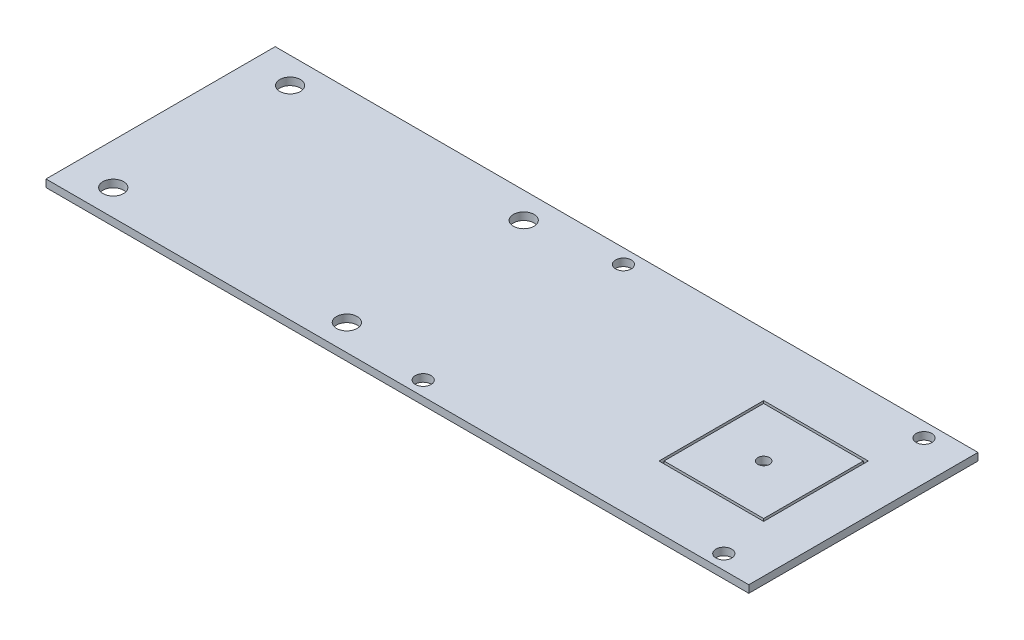
ISO-10303-21;
HEADER;
FILE_DESCRIPTION(('STEP AP214'),'2;1');
FILE_NAME('part.step','',(''),(''),'','','');
FILE_SCHEMA(('AUTOMOTIVE_DESIGN { 1 0 10303 214 1 1 1 1 }'));
ENDSEC;
DATA;
#1=APPLICATION_CONTEXT('core data for automotive mechanical design processes');
#2=APPLICATION_PROTOCOL_DEFINITION('international standard','automotive_design',2000,#1);
#3=PRODUCT_CONTEXT('',#1,'mechanical');
#4=PRODUCT('Part','Part','',(#3));
#5=PRODUCT_RELATED_PRODUCT_CATEGORY('part','',(#4));
#6=PRODUCT_DEFINITION_FORMATION('','',#4);
#7=PRODUCT_DEFINITION_CONTEXT('part definition',#1,'design');
#8=PRODUCT_DEFINITION('design','',#6,#7);
#9=PRODUCT_DEFINITION_SHAPE('','',#8);
#10=(LENGTH_UNIT() NAMED_UNIT(*) SI_UNIT(.MILLI.,.METRE.));
#11=(NAMED_UNIT(*) PLANE_ANGLE_UNIT() SI_UNIT($,.RADIAN.));
#12=(NAMED_UNIT(*) SI_UNIT($,.STERADIAN.) SOLID_ANGLE_UNIT());
#13=UNCERTAINTY_MEASURE_WITH_UNIT(LENGTH_MEASURE(1.E-05),#10,'distance_accuracy_value','');
#14=(GEOMETRIC_REPRESENTATION_CONTEXT(3) GLOBAL_UNCERTAINTY_ASSIGNED_CONTEXT((#13)) GLOBAL_UNIT_ASSIGNED_CONTEXT((#10,
#11,#12)) REPRESENTATION_CONTEXT('',''));
#15=CARTESIAN_POINT('',(0.,0.,0.));
#16=DIRECTION('',(0.,0.,1.));
#17=DIRECTION('',(1.,0.,0.));
#18=AXIS2_PLACEMENT_3D('',#15,#16,#17);
#19=CARTESIAN_POINT('',(0.,1.5,0.));
#20=DIRECTION('',(0.,-1.,0.));
#21=DIRECTION('',(0.,0.,-1.));
#22=AXIS2_PLACEMENT_3D('',#19,#20,#21);
#23=PLANE('',#22);
#24=CARTESIAN_POINT('',(50.51,1.5,0.));
#25=DIRECTION('',(0.,1.,0.));
#26=DIRECTION('',(0.,0.,1.));
#27=AXIS2_PLACEMENT_3D('',#24,#25,#26);
#28=CIRCLE('',#27,1.185);
#29=CARTESIAN_POINT('',(50.51,1.5,1.185));
#30=VERTEX_POINT('',#29);
#31=EDGE_CURVE('E224',#30,#30,#28,.T.);
#32=ORIENTED_EDGE('',*,*,#31,.F.);
#33=EDGE_LOOP('',(#32));
#34=FACE_BOUND('',#33,.T.);
#35=DIRECTION('',(0.,0.,-1.));
#36=VECTOR('',#35,1.);
#37=CARTESIAN_POINT('',(60.51,1.5,10.));
#38=LINE('',#37,#36);
#39=CARTESIAN_POINT('',(60.51,1.5,10.));
#40=VERTEX_POINT('',#39);
#41=CARTESIAN_POINT('',(60.51,1.5,-10.));
#42=VERTEX_POINT('',#41);
#43=EDGE_CURVE('E185',#40,#42,#38,.T.);
#44=ORIENTED_EDGE('',*,*,#43,.T.);
#45=DIRECTION('',(-1.,0.,0.));
#46=VECTOR('',#45,1.);
#47=CARTESIAN_POINT('',(40.51,1.5,-10.));
#48=LINE('',#47,#46);
#49=CARTESIAN_POINT('',(40.51,1.5,-10.));
#50=VERTEX_POINT('',#49);
#51=EDGE_CURVE('E158',#42,#50,#48,.T.);
#52=ORIENTED_EDGE('',*,*,#51,.T.);
#53=DIRECTION('',(0.,0.,1.));
#54=VECTOR('',#53,1.);
#55=CARTESIAN_POINT('',(40.51,1.5,10.));
#56=LINE('',#55,#54);
#57=CARTESIAN_POINT('',(40.51,1.5,10.));
#58=VERTEX_POINT('',#57);
#59=EDGE_CURVE('E86',#50,#58,#56,.T.);
#60=ORIENTED_EDGE('',*,*,#59,.T.);
#61=DIRECTION('',(1.,0.,0.));
#62=VECTOR('',#61,1.);
#63=CARTESIAN_POINT('',(40.51,1.5,10.));
#64=LINE('',#63,#62);
#65=EDGE_CURVE('E178',#58,#40,#64,.T.);
#66=ORIENTED_EDGE('',*,*,#65,.T.);
#67=EDGE_LOOP('',(#44,#52,#60,#66));
#68=FACE_BOUND('',#67,.T.);
#69=ADVANCED_FACE('F63',(#34,#68),#23,.F.);
#70=DIRECTION('',(-1.,0.,0.));
#71=VECTOR('',#70,1.);
#72=CARTESIAN_POINT('',(0.,1.5,-10.5));
#73=LINE('',#72,#71);
#74=CARTESIAN_POINT('',(61.01,1.5,-10.5));
#75=VERTEX_POINT('',#74);
#76=CARTESIAN_POINT('',(40.01,1.5,-10.5));
#77=VERTEX_POINT('',#76);
#78=EDGE_CURVE('E208',#75,#77,#73,.T.);
#79=ORIENTED_EDGE('',*,*,#78,.F.);
#80=DIRECTION('',(0.,0.,-1.));
#81=VECTOR('',#80,1.);
#82=CARTESIAN_POINT('',(61.01,1.5,0.));
#83=LINE('',#82,#81);
#84=CARTESIAN_POINT('',(61.01,1.5,10.5));
#85=VERTEX_POINT('',#84);
#86=EDGE_CURVE('E78',#85,#75,#83,.T.);
#87=ORIENTED_EDGE('',*,*,#86,.F.);
#88=DIRECTION('',(1.,0.,0.));
#89=VECTOR('',#88,1.);
#90=CARTESIAN_POINT('',(0.,1.5,10.5));
#91=LINE('',#90,#89);
#92=CARTESIAN_POINT('',(40.01,1.5,10.5));
#93=VERTEX_POINT('',#92);
#94=EDGE_CURVE('E197',#93,#85,#91,.T.);
#95=ORIENTED_EDGE('',*,*,#94,.F.);
#96=DIRECTION('',(0.,0.,1.));
#97=VECTOR('',#96,1.);
#98=CARTESIAN_POINT('',(40.01,1.5,0.));
#99=LINE('',#98,#97);
#100=EDGE_CURVE('E211',#77,#93,#99,.T.);
#101=ORIENTED_EDGE('',*,*,#100,.F.);
#102=EDGE_LOOP('',(#79,#87,#95,#101));
#103=FACE_BOUND('',#102,.T.);
#104=DIRECTION('',(0.,0.,-1.));
#105=VECTOR('',#104,1.);
#106=CARTESIAN_POINT('',(70.525,1.5,23.));
#107=LINE('',#106,#105);
#108=CARTESIAN_POINT('',(70.525,1.5,23.));
#109=VERTEX_POINT('',#108);
#110=CARTESIAN_POINT('',(70.525,1.5,-23.));
#111=VERTEX_POINT('',#110);
#112=EDGE_CURVE('E278',#109,#111,#107,.T.);
#113=ORIENTED_EDGE('',*,*,#112,.T.);
#114=DIRECTION('',(-1.,0.,0.));
#115=VECTOR('',#114,1.);
#116=CARTESIAN_POINT('',(-70.525,1.5,-23.));
#117=LINE('',#116,#115);
#118=CARTESIAN_POINT('',(-70.525,1.5,-23.));
#119=VERTEX_POINT('',#118);
#120=EDGE_CURVE('E281',#111,#119,#117,.T.);
#121=ORIENTED_EDGE('',*,*,#120,.T.);
#122=DIRECTION('',(0.,0.,1.));
#123=VECTOR('',#122,1.);
#124=CARTESIAN_POINT('',(-70.525,1.5,23.));
#125=LINE('',#124,#123);
#126=CARTESIAN_POINT('',(-70.525,1.5,23.));
#127=VERTEX_POINT('',#126);
#128=EDGE_CURVE('E284',#119,#127,#125,.T.);
#129=ORIENTED_EDGE('',*,*,#128,.T.);
#130=DIRECTION('',(1.,0.,0.));
#131=VECTOR('',#130,1.);
#132=CARTESIAN_POINT('',(-70.525,1.5,23.));
#133=LINE('',#132,#131);
#134=EDGE_CURVE('E286',#127,#109,#133,.T.);
#135=ORIENTED_EDGE('',*,*,#134,.T.);
#136=EDGE_LOOP('',(#113,#121,#129,#135));
#137=FACE_BOUND('',#136,.T.);
#138=CARTESIAN_POINT('',(-62.28,1.5,17.75));
#139=DIRECTION('',(0.,1.,0.));
#140=DIRECTION('',(0.,0.,1.));
#141=AXIS2_PLACEMENT_3D('',#138,#139,#140);
#142=CIRCLE('',#141,2.075);
#143=CARTESIAN_POINT('',(-62.28,1.5,19.825));
#144=VERTEX_POINT('',#143);
#145=EDGE_CURVE('E272',#144,#144,#142,.T.);
#146=ORIENTED_EDGE('',*,*,#145,.F.);
#147=EDGE_LOOP('',(#146));
#148=FACE_BOUND('',#147,.T.);
#149=CARTESIAN_POINT('',(-15.4,1.5,17.75));
#150=DIRECTION('',(0.,1.,0.));
#151=DIRECTION('',(0.,0.,1.));
#152=AXIS2_PLACEMENT_3D('',#149,#150,#151);
#153=CIRCLE('',#152,2.075);
#154=CARTESIAN_POINT('',(-15.4,1.5,19.825));
#155=VERTEX_POINT('',#154);
#156=EDGE_CURVE('E266',#155,#155,#153,.T.);
#157=ORIENTED_EDGE('',*,*,#156,.F.);
#158=EDGE_LOOP('',(#157));
#159=FACE_BOUND('',#158,.T.);
#160=CARTESIAN_POINT('',(-15.4,1.5,-17.75));
#161=DIRECTION('',(0.,1.,0.));
#162=DIRECTION('',(0.,0.,1.));
#163=AXIS2_PLACEMENT_3D('',#160,#161,#162);
#164=CIRCLE('',#163,2.075);
#165=CARTESIAN_POINT('',(-15.4,1.5,-15.675));
#166=VERTEX_POINT('',#165);
#167=EDGE_CURVE('E260',#166,#166,#164,.T.);
#168=ORIENTED_EDGE('',*,*,#167,.F.);
#169=EDGE_LOOP('',(#168));
#170=FACE_BOUND('',#169,.T.);
#171=CARTESIAN_POINT('',(-62.28,1.5,-17.75));
#172=DIRECTION('',(0.,1.,0.));
#173=DIRECTION('',(0.,0.,1.));
#174=AXIS2_PLACEMENT_3D('',#171,#172,#173);
#175=CIRCLE('',#174,2.075);
#176=CARTESIAN_POINT('',(-62.28,1.5,-15.675));
#177=VERTEX_POINT('',#176);
#178=EDGE_CURVE('E254',#177,#177,#175,.T.);
#179=ORIENTED_EDGE('',*,*,#178,.F.);
#180=EDGE_LOOP('',(#179));
#181=FACE_BOUND('',#180,.T.);
#182=CARTESIAN_POINT('',(2.27,1.5,20.09));
#183=DIRECTION('',(0.,1.,0.));
#184=DIRECTION('',(0.,0.,1.));
#185=AXIS2_PLACEMENT_3D('',#182,#183,#184);
#186=CIRCLE('',#185,1.575);
#187=CARTESIAN_POINT('',(2.27,1.5,21.665));
#188=VERTEX_POINT('',#187);
#189=EDGE_CURVE('E248',#188,#188,#186,.T.);
#190=ORIENTED_EDGE('',*,*,#189,.F.);
#191=EDGE_LOOP('',(#190));
#192=FACE_BOUND('',#191,.T.);
#193=CARTESIAN_POINT('',(62.6,1.5,20.09));
#194=DIRECTION('',(0.,1.,0.));
#195=DIRECTION('',(0.,0.,1.));
#196=AXIS2_PLACEMENT_3D('',#193,#194,#195);
#197=CIRCLE('',#196,1.57499999999999);
#198=CARTESIAN_POINT('',(62.6,1.5,21.665));
#199=VERTEX_POINT('',#198);
#200=EDGE_CURVE('E242',#199,#199,#197,.T.);
#201=ORIENTED_EDGE('',*,*,#200,.F.);
#202=EDGE_LOOP('',(#201));
#203=FACE_BOUND('',#202,.T.);
#204=CARTESIAN_POINT('',(62.6,1.5,-20.09));
#205=DIRECTION('',(0.,1.,0.));
#206=DIRECTION('',(0.,0.,1.));
#207=AXIS2_PLACEMENT_3D('',#204,#205,#206);
#208=CIRCLE('',#207,1.57499999999999);
#209=CARTESIAN_POINT('',(62.6,1.5,-18.515));
#210=VERTEX_POINT('',#209);
#211=EDGE_CURVE('E236',#210,#210,#208,.T.);
#212=ORIENTED_EDGE('',*,*,#211,.F.);
#213=EDGE_LOOP('',(#212));
#214=FACE_BOUND('',#213,.T.);
#215=CARTESIAN_POINT('',(2.27,1.5,-20.09));
#216=DIRECTION('',(0.,1.,0.));
#217=DIRECTION('',(0.,0.,1.));
#218=AXIS2_PLACEMENT_3D('',#215,#216,#217);
#219=CIRCLE('',#218,1.575);
#220=CARTESIAN_POINT('',(2.27,1.5,-18.515));
#221=VERTEX_POINT('',#220);
#222=EDGE_CURVE('E230',#221,#221,#219,.T.);
#223=ORIENTED_EDGE('',*,*,#222,.F.);
#224=EDGE_LOOP('',(#223));
#225=FACE_BOUND('',#224,.T.);
#226=ADVANCED_FACE('F321',(#103,#137,#148,#159,#170,#181,#192,#203,#214,#225),#23,.F.);
#227=CARTESIAN_POINT('',(0.,0.,0.));
#228=DIRECTION('',(0.,-1.,0.));
#229=DIRECTION('',(0.,0.,-1.));
#230=AXIS2_PLACEMENT_3D('',#227,#228,#229);
#231=PLANE('',#230);
#232=CARTESIAN_POINT('',(2.27,0.,-20.09));
#233=DIRECTION('',(0.,1.,0.));
#234=DIRECTION('',(0.,0.,1.));
#235=AXIS2_PLACEMENT_3D('',#232,#233,#234);
#236=CIRCLE('',#235,1.575);
#237=CARTESIAN_POINT('',(2.27,0.,-18.515));
#238=VERTEX_POINT('',#237);
#239=EDGE_CURVE('E227',#238,#238,#236,.T.);
#240=ORIENTED_EDGE('',*,*,#239,.T.);
#241=EDGE_LOOP('',(#240));
#242=FACE_BOUND('',#241,.T.);
#243=CARTESIAN_POINT('',(62.6,0.,20.09));
#244=DIRECTION('',(0.,1.,0.));
#245=DIRECTION('',(0.,0.,1.));
#246=AXIS2_PLACEMENT_3D('',#243,#244,#245);
#247=CIRCLE('',#246,1.57499999999999);
#248=CARTESIAN_POINT('',(62.6,0.,21.665));
#249=VERTEX_POINT('',#248);
#250=EDGE_CURVE('E239',#249,#249,#247,.T.);
#251=ORIENTED_EDGE('',*,*,#250,.T.);
#252=EDGE_LOOP('',(#251));
#253=FACE_BOUND('',#252,.T.);
#254=CARTESIAN_POINT('',(-62.28,0.,-17.75));
#255=DIRECTION('',(0.,1.,0.));
#256=DIRECTION('',(0.,0.,1.));
#257=AXIS2_PLACEMENT_3D('',#254,#255,#256);
#258=CIRCLE('',#257,2.075);
#259=CARTESIAN_POINT('',(-62.28,0.,-15.675));
#260=VERTEX_POINT('',#259);
#261=EDGE_CURVE('E251',#260,#260,#258,.T.);
#262=ORIENTED_EDGE('',*,*,#261,.T.);
#263=EDGE_LOOP('',(#262));
#264=FACE_BOUND('',#263,.T.);
#265=CARTESIAN_POINT('',(-15.4,0.,17.75));
#266=DIRECTION('',(0.,1.,0.));
#267=DIRECTION('',(0.,0.,1.));
#268=AXIS2_PLACEMENT_3D('',#265,#266,#267);
#269=CIRCLE('',#268,2.075);
#270=CARTESIAN_POINT('',(-15.4,0.,19.825));
#271=VERTEX_POINT('',#270);
#272=EDGE_CURVE('E263',#271,#271,#269,.T.);
#273=ORIENTED_EDGE('',*,*,#272,.T.);
#274=EDGE_LOOP('',(#273));
#275=FACE_BOUND('',#274,.T.);
#276=DIRECTION('',(0.,0.,-1.));
#277=VECTOR('',#276,1.);
#278=CARTESIAN_POINT('',(70.525,0.,23.));
#279=LINE('',#278,#277);
#280=CARTESIAN_POINT('',(70.525,0.,23.));
#281=VERTEX_POINT('',#280);
#282=CARTESIAN_POINT('',(70.525,0.,-23.));
#283=VERTEX_POINT('',#282);
#284=EDGE_CURVE('E275',#281,#283,#279,.T.);
#285=ORIENTED_EDGE('',*,*,#284,.F.);
#286=DIRECTION('',(1.,0.,0.));
#287=VECTOR('',#286,1.);
#288=CARTESIAN_POINT('',(-70.525,0.,23.));
#289=LINE('',#288,#287);
#290=CARTESIAN_POINT('',(-70.525,0.,23.));
#291=VERTEX_POINT('',#290);
#292=EDGE_CURVE('E282',#291,#281,#289,.T.);
#293=ORIENTED_EDGE('',*,*,#292,.F.);
#294=DIRECTION('',(0.,0.,1.));
#295=VECTOR('',#294,1.);
#296=CARTESIAN_POINT('',(-70.525,0.,23.));
#297=LINE('',#296,#295);
#298=CARTESIAN_POINT('',(-70.525,0.,-23.));
#299=VERTEX_POINT('',#298);
#300=EDGE_CURVE('E293',#299,#291,#297,.T.);
#301=ORIENTED_EDGE('',*,*,#300,.F.);
#302=DIRECTION('',(-1.,0.,0.));
#303=VECTOR('',#302,1.);
#304=CARTESIAN_POINT('',(-70.525,0.,-23.));
#305=LINE('',#304,#303);
#306=EDGE_CURVE('E291',#283,#299,#305,.T.);
#307=ORIENTED_EDGE('',*,*,#306,.F.);
#308=EDGE_LOOP('',(#285,#293,#301,#307));
#309=FACE_BOUND('',#308,.T.);
#310=CARTESIAN_POINT('',(-62.28,0.,17.75));
#311=DIRECTION('',(0.,1.,0.));
#312=DIRECTION('',(0.,0.,1.));
#313=AXIS2_PLACEMENT_3D('',#310,#311,#312);
#314=CIRCLE('',#313,2.075);
#315=CARTESIAN_POINT('',(-62.28,0.,19.825));
#316=VERTEX_POINT('',#315);
#317=EDGE_CURVE('E269',#316,#316,#314,.T.);
#318=ORIENTED_EDGE('',*,*,#317,.T.);
#319=EDGE_LOOP('',(#318));
#320=FACE_BOUND('',#319,.T.);
#321=CARTESIAN_POINT('',(-15.4,0.,-17.75));
#322=DIRECTION('',(0.,1.,0.));
#323=DIRECTION('',(0.,0.,1.));
#324=AXIS2_PLACEMENT_3D('',#321,#322,#323);
#325=CIRCLE('',#324,2.075);
#326=CARTESIAN_POINT('',(-15.4,0.,-15.675));
#327=VERTEX_POINT('',#326);
#328=EDGE_CURVE('E257',#327,#327,#325,.T.);
#329=ORIENTED_EDGE('',*,*,#328,.T.);
#330=EDGE_LOOP('',(#329));
#331=FACE_BOUND('',#330,.T.);
#332=CARTESIAN_POINT('',(2.27,0.,20.09));
#333=DIRECTION('',(0.,1.,0.));
#334=DIRECTION('',(0.,0.,1.));
#335=AXIS2_PLACEMENT_3D('',#332,#333,#334);
#336=CIRCLE('',#335,1.575);
#337=CARTESIAN_POINT('',(2.27,0.,21.665));
#338=VERTEX_POINT('',#337);
#339=EDGE_CURVE('E245',#338,#338,#336,.T.);
#340=ORIENTED_EDGE('',*,*,#339,.T.);
#341=EDGE_LOOP('',(#340));
#342=FACE_BOUND('',#341,.T.);
#343=CARTESIAN_POINT('',(62.6,0.,-20.09));
#344=DIRECTION('',(0.,1.,0.));
#345=DIRECTION('',(0.,0.,1.));
#346=AXIS2_PLACEMENT_3D('',#343,#344,#345);
#347=CIRCLE('',#346,1.57499999999999);
#348=CARTESIAN_POINT('',(62.6,0.,-18.515));
#349=VERTEX_POINT('',#348);
#350=EDGE_CURVE('E233',#349,#349,#347,.T.);
#351=ORIENTED_EDGE('',*,*,#350,.T.);
#352=EDGE_LOOP('',(#351));
#353=FACE_BOUND('',#352,.T.);
#354=CARTESIAN_POINT('',(50.51,0.,0.));
#355=DIRECTION('',(0.,1.,0.));
#356=DIRECTION('',(0.,0.,1.));
#357=AXIS2_PLACEMENT_3D('',#354,#355,#356);
#358=CIRCLE('',#357,1.185);
#359=CARTESIAN_POINT('',(50.51,0.,1.185));
#360=VERTEX_POINT('',#359);
#361=EDGE_CURVE('E218',#360,#360,#358,.T.);
#362=ORIENTED_EDGE('',*,*,#361,.T.);
#363=EDGE_LOOP('',(#362));
#364=FACE_BOUND('',#363,.T.);
#365=ADVANCED_FACE('F311',(#242,#253,#264,#275,#309,#320,#331,#342,#353,#364),#231,.T.);
#366=CARTESIAN_POINT('',(70.525,1.5,23.));
#367=DIRECTION('',(-1.,0.,0.));
#368=DIRECTION('',(0.,0.,1.));
#369=AXIS2_PLACEMENT_3D('',#366,#367,#368);
#370=PLANE('',#369);
#371=ORIENTED_EDGE('',*,*,#284,.T.);
#372=DIRECTION('',(0.,-1.,0.));
#373=VECTOR('',#372,1.);
#374=CARTESIAN_POINT('',(70.525,1.5,-23.));
#375=LINE('',#374,#373);
#376=EDGE_CURVE('E12',#111,#283,#375,.T.);
#377=ORIENTED_EDGE('',*,*,#376,.F.);
#378=ORIENTED_EDGE('',*,*,#112,.F.);
#379=DIRECTION('',(0.,-1.,0.));
#380=VECTOR('',#379,1.);
#381=CARTESIAN_POINT('',(70.525,1.5,23.));
#382=LINE('',#381,#380);
#383=EDGE_CURVE('E288',#109,#281,#382,.T.);
#384=ORIENTED_EDGE('',*,*,#383,.T.);
#385=EDGE_LOOP('',(#371,#377,#378,#384));
#386=FACE_BOUND('',#385,.T.);
#387=ADVANCED_FACE('F65',(#386),#370,.F.);
#388=CARTESIAN_POINT('',(-70.525,1.5,-23.));
#389=DIRECTION('',(0.,0.,1.));
#390=DIRECTION('',(1.,0.,0.));
#391=AXIS2_PLACEMENT_3D('',#388,#389,#390);
#392=PLANE('',#391);
#393=ORIENTED_EDGE('',*,*,#306,.T.);
#394=DIRECTION('',(0.,-1.,0.));
#395=VECTOR('',#394,1.);
#396=CARTESIAN_POINT('',(-70.525,1.5,-23.));
#397=LINE('',#396,#395);
#398=EDGE_CURVE('E71',#119,#299,#397,.T.);
#399=ORIENTED_EDGE('',*,*,#398,.F.);
#400=ORIENTED_EDGE('',*,*,#120,.F.);
#401=ORIENTED_EDGE('',*,*,#376,.T.);
#402=EDGE_LOOP('',(#393,#399,#400,#401));
#403=FACE_BOUND('',#402,.T.);
#404=ADVANCED_FACE('F323',(#403),#392,.F.);
#405=CARTESIAN_POINT('',(-70.525,1.5,23.));
#406=DIRECTION('',(1.,0.,0.));
#407=DIRECTION('',(0.,0.,-1.));
#408=AXIS2_PLACEMENT_3D('',#405,#406,#407);
#409=PLANE('',#408);
#410=ORIENTED_EDGE('',*,*,#300,.T.);
#411=DIRECTION('',(0.,-1.,0.));
#412=VECTOR('',#411,1.);
#413=CARTESIAN_POINT('',(-70.525,1.5,23.));
#414=LINE('',#413,#412);
#415=EDGE_CURVE('E298',#127,#291,#414,.T.);
#416=ORIENTED_EDGE('',*,*,#415,.F.);
#417=ORIENTED_EDGE('',*,*,#128,.F.);
#418=ORIENTED_EDGE('',*,*,#398,.T.);
#419=EDGE_LOOP('',(#410,#416,#417,#418));
#420=FACE_BOUND('',#419,.T.);
#421=ADVANCED_FACE('F305',(#420),#409,.F.);
#422=CARTESIAN_POINT('',(-70.525,1.5,23.));
#423=DIRECTION('',(0.,0.,-1.));
#424=DIRECTION('',(-1.,0.,0.));
#425=AXIS2_PLACEMENT_3D('',#422,#423,#424);
#426=PLANE('',#425);
#427=ORIENTED_EDGE('',*,*,#292,.T.);
#428=ORIENTED_EDGE('',*,*,#383,.F.);
#429=ORIENTED_EDGE('',*,*,#134,.F.);
#430=ORIENTED_EDGE('',*,*,#415,.T.);
#431=EDGE_LOOP('',(#427,#428,#429,#430));
#432=FACE_BOUND('',#431,.T.);
#433=ADVANCED_FACE('F315',(#432),#426,.F.);
#434=CARTESIAN_POINT('',(-62.28,1.5,17.75));
#435=DIRECTION('',(0.,-1.,0.));
#436=DIRECTION('',(0.,0.,-1.));
#437=AXIS2_PLACEMENT_3D('',#434,#435,#436);
#438=CYLINDRICAL_SURFACE('',#437,2.075);
#439=ORIENTED_EDGE('',*,*,#145,.T.);
#440=EDGE_LOOP('',(#439));
#441=FACE_BOUND('',#440,.T.);
#442=ORIENTED_EDGE('',*,*,#317,.F.);
#443=EDGE_LOOP('',(#442));
#444=FACE_BOUND('',#443,.T.);
#445=ADVANCED_FACE('F341',(#441,#444),#438,.F.);
#446=CARTESIAN_POINT('',(-15.4,1.5,17.75));
#447=DIRECTION('',(0.,-1.,0.));
#448=DIRECTION('',(0.,0.,-1.));
#449=AXIS2_PLACEMENT_3D('',#446,#447,#448);
#450=CYLINDRICAL_SURFACE('',#449,2.075);
#451=ORIENTED_EDGE('',*,*,#156,.T.);
#452=EDGE_LOOP('',(#451));
#453=FACE_BOUND('',#452,.T.);
#454=ORIENTED_EDGE('',*,*,#272,.F.);
#455=EDGE_LOOP('',(#454));
#456=FACE_BOUND('',#455,.T.);
#457=ADVANCED_FACE('F350',(#453,#456),#450,.F.);
#458=CARTESIAN_POINT('',(-15.4,1.5,-17.75));
#459=DIRECTION('',(0.,-1.,0.));
#460=DIRECTION('',(0.,0.,-1.));
#461=AXIS2_PLACEMENT_3D('',#458,#459,#460);
#462=CYLINDRICAL_SURFACE('',#461,2.075);
#463=ORIENTED_EDGE('',*,*,#167,.T.);
#464=EDGE_LOOP('',(#463));
#465=FACE_BOUND('',#464,.T.);
#466=ORIENTED_EDGE('',*,*,#328,.F.);
#467=EDGE_LOOP('',(#466));
#468=FACE_BOUND('',#467,.T.);
#469=ADVANCED_FACE('F355',(#465,#468),#462,.F.);
#470=CARTESIAN_POINT('',(-62.28,1.5,-17.75));
#471=DIRECTION('',(0.,-1.,0.));
#472=DIRECTION('',(0.,0.,-1.));
#473=AXIS2_PLACEMENT_3D('',#470,#471,#472);
#474=CYLINDRICAL_SURFACE('',#473,2.075);
#475=ORIENTED_EDGE('',*,*,#178,.T.);
#476=EDGE_LOOP('',(#475));
#477=FACE_BOUND('',#476,.T.);
#478=ORIENTED_EDGE('',*,*,#261,.F.);
#479=EDGE_LOOP('',(#478));
#480=FACE_BOUND('',#479,.T.);
#481=ADVANCED_FACE('F396',(#477,#480),#474,.F.);
#482=CARTESIAN_POINT('',(2.27,1.5,20.09));
#483=DIRECTION('',(0.,-1.,0.));
#484=DIRECTION('',(0.,0.,-1.));
#485=AXIS2_PLACEMENT_3D('',#482,#483,#484);
#486=CYLINDRICAL_SURFACE('',#485,1.575);
#487=ORIENTED_EDGE('',*,*,#189,.T.);
#488=EDGE_LOOP('',(#487));
#489=FACE_BOUND('',#488,.T.);
#490=ORIENTED_EDGE('',*,*,#339,.F.);
#491=EDGE_LOOP('',(#490));
#492=FACE_BOUND('',#491,.T.);
#493=ADVANCED_FACE('F392',(#489,#492),#486,.F.);
#494=CARTESIAN_POINT('',(62.6,1.5,20.09));
#495=DIRECTION('',(0.,-1.,0.));
#496=DIRECTION('',(0.,0.,-1.));
#497=AXIS2_PLACEMENT_3D('',#494,#495,#496);
#498=CYLINDRICAL_SURFACE('',#497,1.57499999999999);
#499=ORIENTED_EDGE('',*,*,#200,.T.);
#500=EDGE_LOOP('',(#499));
#501=FACE_BOUND('',#500,.T.);
#502=ORIENTED_EDGE('',*,*,#250,.F.);
#503=EDGE_LOOP('',(#502));
#504=FACE_BOUND('',#503,.T.);
#505=ADVANCED_FACE('F388',(#501,#504),#498,.F.);
#506=CARTESIAN_POINT('',(62.6,1.5,-20.09));
#507=DIRECTION('',(0.,-1.,0.));
#508=DIRECTION('',(0.,0.,-1.));
#509=AXIS2_PLACEMENT_3D('',#506,#507,#508);
#510=CYLINDRICAL_SURFACE('',#509,1.57499999999999);
#511=ORIENTED_EDGE('',*,*,#211,.T.);
#512=EDGE_LOOP('',(#511));
#513=FACE_BOUND('',#512,.T.);
#514=ORIENTED_EDGE('',*,*,#350,.F.);
#515=EDGE_LOOP('',(#514));
#516=FACE_BOUND('',#515,.T.);
#517=ADVANCED_FACE('F381',(#513,#516),#510,.F.);
#518=CARTESIAN_POINT('',(2.27,1.5,-20.09));
#519=DIRECTION('',(0.,-1.,0.));
#520=DIRECTION('',(0.,0.,-1.));
#521=AXIS2_PLACEMENT_3D('',#518,#519,#520);
#522=CYLINDRICAL_SURFACE('',#521,1.575);
#523=ORIENTED_EDGE('',*,*,#222,.T.);
#524=EDGE_LOOP('',(#523));
#525=FACE_BOUND('',#524,.T.);
#526=ORIENTED_EDGE('',*,*,#239,.F.);
#527=EDGE_LOOP('',(#526));
#528=FACE_BOUND('',#527,.T.);
#529=ADVANCED_FACE('F372',(#525,#528),#522,.F.);
#530=CARTESIAN_POINT('',(50.51,1.5,0.));
#531=DIRECTION('',(0.,-1.,0.));
#532=DIRECTION('',(0.,0.,-1.));
#533=AXIS2_PLACEMENT_3D('',#530,#531,#532);
#534=CYLINDRICAL_SURFACE('',#533,1.185);
#535=ORIENTED_EDGE('',*,*,#31,.T.);
#536=EDGE_LOOP('',(#535));
#537=FACE_BOUND('',#536,.T.);
#538=ORIENTED_EDGE('',*,*,#361,.F.);
#539=EDGE_LOOP('',(#538));
#540=FACE_BOUND('',#539,.T.);
#541=ADVANCED_FACE('F369',(#537,#540),#534,.F.);
#542=CARTESIAN_POINT('',(61.01,0.75,0.));
#543=DIRECTION('',(1.,0.,0.));
#544=DIRECTION('',(0.,0.,-1.));
#545=AXIS2_PLACEMENT_3D('',#542,#543,#544);
#546=PLANE('',#545);
#547=ORIENTED_EDGE('',*,*,#86,.T.);
#548=DIRECTION('',(0.,1.,0.));
#549=VECTOR('',#548,1.);
#550=CARTESIAN_POINT('',(61.01,0.75,-10.5));
#551=LINE('',#550,#549);
#552=CARTESIAN_POINT('',(61.01,0.75,-10.5));
#553=VERTEX_POINT('',#552);
#554=EDGE_CURVE('E206',#553,#75,#551,.T.);
#555=ORIENTED_EDGE('',*,*,#554,.F.);
#556=DIRECTION('',(0.,0.,-1.));
#557=VECTOR('',#556,1.);
#558=CARTESIAN_POINT('',(61.01,0.75,0.));
#559=LINE('',#558,#557);
#560=CARTESIAN_POINT('',(61.01,0.75,10.5));
#561=VERTEX_POINT('',#560);
#562=EDGE_CURVE('E193',#561,#553,#559,.T.);
#563=ORIENTED_EDGE('',*,*,#562,.F.);
#564=DIRECTION('',(0.,1.,0.));
#565=VECTOR('',#564,1.);
#566=CARTESIAN_POINT('',(61.01,0.75,10.5));
#567=LINE('',#566,#565);
#568=EDGE_CURVE('E216',#561,#85,#567,.T.);
#569=ORIENTED_EDGE('',*,*,#568,.T.);
#570=EDGE_LOOP('',(#547,#555,#563,#569));
#571=FACE_BOUND('',#570,.T.);
#572=ADVANCED_FACE('F371',(#571),#546,.F.);
#573=CARTESIAN_POINT('',(0.,0.75,10.5));
#574=DIRECTION('',(0.,0.,1.));
#575=DIRECTION('',(1.,0.,0.));
#576=AXIS2_PLACEMENT_3D('',#573,#574,#575);
#577=PLANE('',#576);
#578=ORIENTED_EDGE('',*,*,#94,.T.);
#579=ORIENTED_EDGE('',*,*,#568,.F.);
#580=DIRECTION('',(1.,0.,0.));
#581=VECTOR('',#580,1.);
#582=CARTESIAN_POINT('',(0.,0.75,10.5));
#583=LINE('',#582,#581);
#584=CARTESIAN_POINT('',(40.01,0.75,10.5));
#585=VERTEX_POINT('',#584);
#586=EDGE_CURVE('E203',#585,#561,#583,.T.);
#587=ORIENTED_EDGE('',*,*,#586,.F.);
#588=DIRECTION('',(0.,1.,0.));
#589=VECTOR('',#588,1.);
#590=CARTESIAN_POINT('',(40.01,0.75,10.5));
#591=LINE('',#590,#589);
#592=EDGE_CURVE('E219',#585,#93,#591,.T.);
#593=ORIENTED_EDGE('',*,*,#592,.T.);
#594=EDGE_LOOP('',(#578,#579,#587,#593));
#595=FACE_BOUND('',#594,.T.);
#596=ADVANCED_FACE('F379',(#595),#577,.F.);
#597=CARTESIAN_POINT('',(40.01,0.75,0.));
#598=DIRECTION('',(-1.,0.,0.));
#599=DIRECTION('',(0.,0.,1.));
#600=AXIS2_PLACEMENT_3D('',#597,#598,#599);
#601=PLANE('',#600);
#602=ORIENTED_EDGE('',*,*,#100,.T.);
#603=ORIENTED_EDGE('',*,*,#592,.F.);
#604=DIRECTION('',(0.,0.,1.));
#605=VECTOR('',#604,1.);
#606=CARTESIAN_POINT('',(40.01,0.75,0.));
#607=LINE('',#606,#605);
#608=CARTESIAN_POINT('',(40.01,0.75,-10.5));
#609=VERTEX_POINT('',#608);
#610=EDGE_CURVE('E200',#609,#585,#607,.T.);
#611=ORIENTED_EDGE('',*,*,#610,.F.);
#612=DIRECTION('',(0.,1.,0.));
#613=VECTOR('',#612,1.);
#614=CARTESIAN_POINT('',(40.01,0.75,-10.5));
#615=LINE('',#614,#613);
#616=EDGE_CURVE('E221',#609,#77,#615,.T.);
#617=ORIENTED_EDGE('',*,*,#616,.T.);
#618=EDGE_LOOP('',(#602,#603,#611,#617));
#619=FACE_BOUND('',#618,.T.);
#620=ADVANCED_FACE('F487',(#619),#601,.F.);
#621=CARTESIAN_POINT('',(0.,0.75,-10.5));
#622=DIRECTION('',(0.,0.,-1.));
#623=DIRECTION('',(-1.,0.,0.));
#624=AXIS2_PLACEMENT_3D('',#621,#622,#623);
#625=PLANE('',#624);
#626=ORIENTED_EDGE('',*,*,#78,.T.);
#627=ORIENTED_EDGE('',*,*,#616,.F.);
#628=DIRECTION('',(-1.,0.,0.));
#629=VECTOR('',#628,1.);
#630=CARTESIAN_POINT('',(0.,0.75,-10.5));
#631=LINE('',#630,#629);
#632=EDGE_CURVE('E196',#553,#609,#631,.T.);
#633=ORIENTED_EDGE('',*,*,#632,.F.);
#634=ORIENTED_EDGE('',*,*,#554,.T.);
#635=EDGE_LOOP('',(#626,#627,#633,#634));
#636=FACE_BOUND('',#635,.T.);
#637=ADVANCED_FACE('F498',(#636),#625,.F.);
#638=CARTESIAN_POINT('',(0.,0.75,0.));
#639=DIRECTION('',(0.,1.,0.));
#640=DIRECTION('',(0.,0.,1.));
#641=AXIS2_PLACEMENT_3D('',#638,#639,#640);
#642=PLANE('',#641);
#643=DIRECTION('',(1.,0.,0.));
#644=VECTOR('',#643,1.);
#645=CARTESIAN_POINT('',(40.51,0.75,10.));
#646=LINE('',#645,#644);
#647=CARTESIAN_POINT('',(40.51,0.75,10.));
#648=VERTEX_POINT('',#647);
#649=CARTESIAN_POINT('',(60.51,0.75,10.));
#650=VERTEX_POINT('',#649);
#651=EDGE_CURVE('E164',#648,#650,#646,.T.);
#652=ORIENTED_EDGE('',*,*,#651,.F.);
#653=DIRECTION('',(0.,0.,1.));
#654=VECTOR('',#653,1.);
#655=CARTESIAN_POINT('',(40.51,0.75,10.));
#656=LINE('',#655,#654);
#657=CARTESIAN_POINT('',(40.51,0.75,-10.));
#658=VERTEX_POINT('',#657);
#659=EDGE_CURVE('E174',#658,#648,#656,.T.);
#660=ORIENTED_EDGE('',*,*,#659,.F.);
#661=DIRECTION('',(-1.,0.,0.));
#662=VECTOR('',#661,1.);
#663=CARTESIAN_POINT('',(40.51,0.75,-10.));
#664=LINE('',#663,#662);
#665=CARTESIAN_POINT('',(60.51,0.75,-10.));
#666=VERTEX_POINT('',#665);
#667=EDGE_CURVE('E156',#666,#658,#664,.T.);
#668=ORIENTED_EDGE('',*,*,#667,.F.);
#669=DIRECTION('',(0.,0.,-1.));
#670=VECTOR('',#669,1.);
#671=CARTESIAN_POINT('',(60.51,0.75,10.));
#672=LINE('',#671,#670);
#673=EDGE_CURVE('E171',#650,#666,#672,.T.);
#674=ORIENTED_EDGE('',*,*,#673,.F.);
#675=EDGE_LOOP('',(#652,#660,#668,#674));
#676=FACE_BOUND('',#675,.T.);
#677=ORIENTED_EDGE('',*,*,#562,.T.);
#678=ORIENTED_EDGE('',*,*,#632,.T.);
#679=ORIENTED_EDGE('',*,*,#610,.T.);
#680=ORIENTED_EDGE('',*,*,#586,.T.);
#681=EDGE_LOOP('',(#677,#678,#679,#680));
#682=FACE_BOUND('',#681,.T.);
#683=ADVANCED_FACE('F169',(#676,#682),#642,.T.);
#684=CARTESIAN_POINT('',(60.51,0.75,10.));
#685=DIRECTION('',(1.,0.,0.));
#686=DIRECTION('',(0.,0.,-1.));
#687=AXIS2_PLACEMENT_3D('',#684,#685,#686);
#688=PLANE('',#687);
#689=ORIENTED_EDGE('',*,*,#43,.F.);
#690=DIRECTION('',(0.,1.,0.));
#691=VECTOR('',#690,1.);
#692=CARTESIAN_POINT('',(60.51,0.75,10.));
#693=LINE('',#692,#691);
#694=EDGE_CURVE('E177',#650,#40,#693,.T.);
#695=ORIENTED_EDGE('',*,*,#694,.F.);
#696=ORIENTED_EDGE('',*,*,#673,.T.);
#697=DIRECTION('',(0.,1.,0.));
#698=VECTOR('',#697,1.);
#699=CARTESIAN_POINT('',(60.51,0.75,-10.));
#700=LINE('',#699,#698);
#701=EDGE_CURVE('E153',#666,#42,#700,.T.);
#702=ORIENTED_EDGE('',*,*,#701,.T.);
#703=EDGE_LOOP('',(#689,#695,#696,#702));
#704=FACE_BOUND('',#703,.T.);
#705=ADVANCED_FACE('F176',(#704),#688,.T.);
#706=CARTESIAN_POINT('',(40.51,0.75,10.));
#707=DIRECTION('',(0.,0.,1.));
#708=DIRECTION('',(1.,0.,0.));
#709=AXIS2_PLACEMENT_3D('',#706,#707,#708);
#710=PLANE('',#709);
#711=ORIENTED_EDGE('',*,*,#65,.F.);
#712=DIRECTION('',(0.,1.,0.));
#713=VECTOR('',#712,1.);
#714=CARTESIAN_POINT('',(40.51,0.75,10.));
#715=LINE('',#714,#713);
#716=EDGE_CURVE('E190',#648,#58,#715,.T.);
#717=ORIENTED_EDGE('',*,*,#716,.F.);
#718=ORIENTED_EDGE('',*,*,#651,.T.);
#719=ORIENTED_EDGE('',*,*,#694,.T.);
#720=EDGE_LOOP('',(#711,#717,#718,#719));
#721=FACE_BOUND('',#720,.T.);
#722=ADVANCED_FACE('F527',(#721),#710,.T.);
#723=CARTESIAN_POINT('',(40.51,0.75,10.));
#724=DIRECTION('',(-1.,0.,0.));
#725=DIRECTION('',(0.,0.,1.));
#726=AXIS2_PLACEMENT_3D('',#723,#724,#725);
#727=PLANE('',#726);
#728=ORIENTED_EDGE('',*,*,#59,.F.);
#729=DIRECTION('',(0.,1.,0.));
#730=VECTOR('',#729,1.);
#731=CARTESIAN_POINT('',(40.51,0.75,-10.));
#732=LINE('',#731,#730);
#733=EDGE_CURVE('E163',#658,#50,#732,.T.);
#734=ORIENTED_EDGE('',*,*,#733,.F.);
#735=ORIENTED_EDGE('',*,*,#659,.T.);
#736=ORIENTED_EDGE('',*,*,#716,.T.);
#737=EDGE_LOOP('',(#728,#734,#735,#736));
#738=FACE_BOUND('',#737,.T.);
#739=ADVANCED_FACE('F537',(#738),#727,.T.);
#740=CARTESIAN_POINT('',(40.51,0.75,-10.));
#741=DIRECTION('',(0.,0.,-1.));
#742=DIRECTION('',(-1.,0.,0.));
#743=AXIS2_PLACEMENT_3D('',#740,#741,#742);
#744=PLANE('',#743);
#745=ORIENTED_EDGE('',*,*,#51,.F.);
#746=ORIENTED_EDGE('',*,*,#701,.F.);
#747=ORIENTED_EDGE('',*,*,#667,.T.);
#748=ORIENTED_EDGE('',*,*,#733,.T.);
#749=EDGE_LOOP('',(#745,#746,#747,#748));
#750=FACE_BOUND('',#749,.T.);
#751=ADVANCED_FACE('F155',(#750),#744,.T.);
#752=CLOSED_SHELL('',(#69,#226,#365,#387,#404,#421,#433,#445,#457,#469,#481,#493,#505,#517,#529,
#541,#572,#596,#620,#637,#683,#705,#722,#739,#751));
#753=MANIFOLD_SOLID_BREP('B2',#752);
#754=ADVANCED_BREP_SHAPE_REPRESENTATION('',(#18,#753),#14);
#755=SHAPE_DEFINITION_REPRESENTATION(#9,#754);
ENDSEC;
END-ISO-10303-21;
